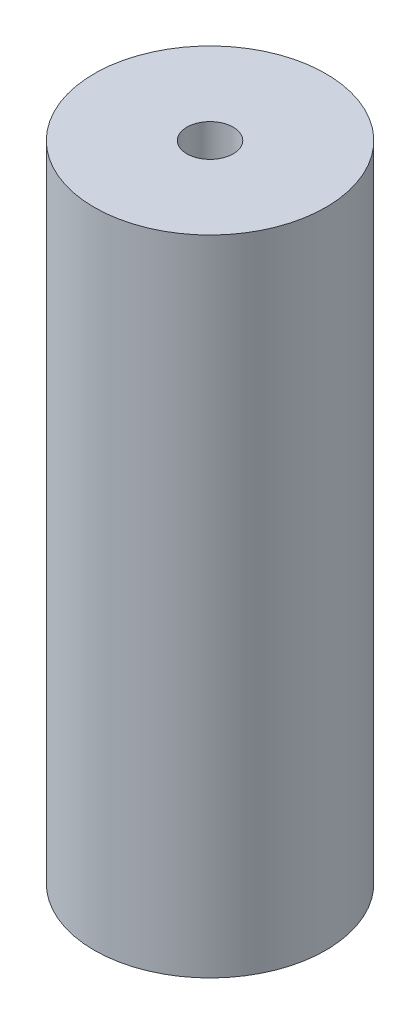
ISO-10303-21;
HEADER;
FILE_DESCRIPTION(('STEP AP214'),'2;1');
FILE_NAME('part.step','',(''),(''),'','','');
FILE_SCHEMA(('AUTOMOTIVE_DESIGN { 1 0 10303 214 1 1 1 1 }'));
ENDSEC;
DATA;
#1=APPLICATION_CONTEXT('core data for automotive mechanical design processes');
#2=APPLICATION_PROTOCOL_DEFINITION('international standard','automotive_design',2000,#1);
#3=PRODUCT_CONTEXT('',#1,'mechanical');
#4=PRODUCT('Part','Part','',(#3));
#5=PRODUCT_RELATED_PRODUCT_CATEGORY('part','',(#4));
#6=PRODUCT_DEFINITION_FORMATION('','',#4);
#7=PRODUCT_DEFINITION_CONTEXT('part definition',#1,'design');
#8=PRODUCT_DEFINITION('design','',#6,#7);
#9=PRODUCT_DEFINITION_SHAPE('','',#8);
#10=(LENGTH_UNIT() NAMED_UNIT(*) SI_UNIT(.MILLI.,.METRE.));
#11=(NAMED_UNIT(*) PLANE_ANGLE_UNIT() SI_UNIT($,.RADIAN.));
#12=(NAMED_UNIT(*) SI_UNIT($,.STERADIAN.) SOLID_ANGLE_UNIT());
#13=UNCERTAINTY_MEASURE_WITH_UNIT(LENGTH_MEASURE(1.E-05),#10,'distance_accuracy_value','');
#14=(GEOMETRIC_REPRESENTATION_CONTEXT(3) GLOBAL_UNCERTAINTY_ASSIGNED_CONTEXT((#13)) GLOBAL_UNIT_ASSIGNED_CONTEXT((#10,
#11,#12)) REPRESENTATION_CONTEXT('',''));
#15=CARTESIAN_POINT('',(0.,0.,0.));
#16=DIRECTION('',(0.,0.,1.));
#17=DIRECTION('',(1.,0.,0.));
#18=AXIS2_PLACEMENT_3D('',#15,#16,#17);
#19=CARTESIAN_POINT('',(0.,0.,0.));
#20=DIRECTION('',(0.,1.,0.));
#21=DIRECTION('',(0.,0.,1.));
#22=AXIS2_PLACEMENT_3D('',#19,#20,#21);
#23=PLANE('',#22);
#24=CARTESIAN_POINT('',(0.,0.,0.));
#25=DIRECTION('',(0.,1.,0.));
#26=DIRECTION('',(0.,0.,1.));
#27=AXIS2_PLACEMENT_3D('',#24,#25,#26);
#28=CIRCLE('',#27,4.5);
#29=CARTESIAN_POINT('',(0.,0.,4.5));
#30=VERTEX_POINT('',#29);
#31=EDGE_CURVE('E10',#30,#30,#28,.T.);
#32=ORIENTED_EDGE('',*,*,#31,.F.);
#33=EDGE_LOOP('',(#32));
#34=FACE_BOUND('',#33,.T.);
#35=CARTESIAN_POINT('',(0.,0.,0.));
#36=DIRECTION('',(0.,1.,0.));
#37=DIRECTION('',(0.,0.,1.));
#38=AXIS2_PLACEMENT_3D('',#35,#36,#37);
#39=CIRCLE('',#38,2.05);
#40=CARTESIAN_POINT('',(0.,0.,2.05));
#41=VERTEX_POINT('',#40);
#42=EDGE_CURVE('E42',#41,#41,#39,.T.);
#43=ORIENTED_EDGE('',*,*,#42,.T.);
#44=EDGE_LOOP('',(#43));
#45=FACE_BOUND('',#44,.T.);
#46=ADVANCED_FACE('F35',(#34,#45),#23,.F.);
#47=CARTESIAN_POINT('',(0.,10.,0.));
#48=DIRECTION('',(0.,-1.,0.));
#49=DIRECTION('',(0.,0.,-1.));
#50=AXIS2_PLACEMENT_3D('',#47,#48,#49);
#51=CYLINDRICAL_SURFACE('',#50,4.5);
#52=ORIENTED_EDGE('',*,*,#31,.T.);
#53=EDGE_LOOP('',(#52));
#54=FACE_BOUND('',#53,.T.);
#55=CARTESIAN_POINT('',(0.,25.,0.));
#56=DIRECTION('',(0.,1.,0.));
#57=DIRECTION('',(0.,0.,1.));
#58=AXIS2_PLACEMENT_3D('',#55,#56,#57);
#59=CIRCLE('',#58,4.5);
#60=CARTESIAN_POINT('',(0.,25.,4.5));
#61=VERTEX_POINT('',#60);
#62=EDGE_CURVE('E50',#61,#61,#59,.T.);
#63=ORIENTED_EDGE('',*,*,#62,.F.);
#64=EDGE_LOOP('',(#63));
#65=FACE_BOUND('',#64,.T.);
#66=ADVANCED_FACE('F37',(#54,#65),#51,.T.);
#67=CARTESIAN_POINT('',(0.,10.,0.));
#68=DIRECTION('',(0.,-1.,0.));
#69=DIRECTION('',(0.,0.,-1.));
#70=AXIS2_PLACEMENT_3D('',#67,#68,#69);
#71=CYLINDRICAL_SURFACE('',#70,2.05);
#72=CARTESIAN_POINT('',(0.,10.,0.));
#73=DIRECTION('',(0.,1.,0.));
#74=DIRECTION('',(0.,0.,1.));
#75=AXIS2_PLACEMENT_3D('',#72,#73,#74);
#76=CIRCLE('',#75,2.05);
#77=CARTESIAN_POINT('',(0.,10.,2.05));
#78=VERTEX_POINT('',#77);
#79=EDGE_CURVE('E46',#78,#78,#76,.T.);
#80=ORIENTED_EDGE('',*,*,#79,.T.);
#81=EDGE_LOOP('',(#80));
#82=FACE_BOUND('',#81,.T.);
#83=ORIENTED_EDGE('',*,*,#42,.F.);
#84=EDGE_LOOP('',(#83));
#85=FACE_BOUND('',#84,.T.);
#86=ADVANCED_FACE('F75',(#82,#85),#71,.F.);
#87=CARTESIAN_POINT('',(0.,10.,0.));
#88=DIRECTION('',(0.,1.,0.));
#89=DIRECTION('',(0.,0.,1.));
#90=AXIS2_PLACEMENT_3D('',#87,#88,#89);
#91=PLANE('',#90);
#92=CARTESIAN_POINT('',(0.,10.,0.));
#93=DIRECTION('',(0.,1.,0.));
#94=DIRECTION('',(0.,0.,1.));
#95=AXIS2_PLACEMENT_3D('',#92,#93,#94);
#96=CIRCLE('',#95,0.9);
#97=CARTESIAN_POINT('',(0.,10.,0.9));
#98=VERTEX_POINT('',#97);
#99=EDGE_CURVE('E56',#98,#98,#96,.T.);
#100=ORIENTED_EDGE('',*,*,#99,.T.);
#101=EDGE_LOOP('',(#100));
#102=FACE_BOUND('',#101,.T.);
#103=ORIENTED_EDGE('',*,*,#79,.F.);
#104=EDGE_LOOP('',(#103));
#105=FACE_BOUND('',#104,.T.);
#106=ADVANCED_FACE('F67',(#102,#105),#91,.F.);
#107=CARTESIAN_POINT('',(0.,25.,0.));
#108=DIRECTION('',(0.,1.,0.));
#109=DIRECTION('',(0.,0.,1.));
#110=AXIS2_PLACEMENT_3D('',#107,#108,#109);
#111=PLANE('',#110);
#112=ORIENTED_EDGE('',*,*,#62,.T.);
#113=EDGE_LOOP('',(#112));
#114=FACE_BOUND('',#113,.T.);
#115=CARTESIAN_POINT('',(0.,25.,0.));
#116=DIRECTION('',(0.,1.,0.));
#117=DIRECTION('',(0.,0.,1.));
#118=AXIS2_PLACEMENT_3D('',#115,#116,#117);
#119=CIRCLE('',#118,0.9);
#120=CARTESIAN_POINT('',(0.,25.,0.9));
#121=VERTEX_POINT('',#120);
#122=EDGE_CURVE('E55',#121,#121,#119,.T.);
#123=ORIENTED_EDGE('',*,*,#122,.F.);
#124=EDGE_LOOP('',(#123));
#125=FACE_BOUND('',#124,.T.);
#126=ADVANCED_FACE('F65',(#114,#125),#111,.T.);
#127=CARTESIAN_POINT('',(0.,25.,0.));
#128=DIRECTION('',(0.,-1.,0.));
#129=DIRECTION('',(0.,0.,-1.));
#130=AXIS2_PLACEMENT_3D('',#127,#128,#129);
#131=CYLINDRICAL_SURFACE('',#130,0.9);
#132=ORIENTED_EDGE('',*,*,#122,.T.);
#133=EDGE_LOOP('',(#132));
#134=FACE_BOUND('',#133,.T.);
#135=ORIENTED_EDGE('',*,*,#99,.F.);
#136=EDGE_LOOP('',(#135));
#137=FACE_BOUND('',#136,.T.);
#138=ADVANCED_FACE('F62',(#134,#137),#131,.F.);
#139=CLOSED_SHELL('',(#46,#66,#86,#106,#126,#138));
#140=MANIFOLD_SOLID_BREP('B2',#139);
#141=ADVANCED_BREP_SHAPE_REPRESENTATION('',(#18,#140),#14);
#142=SHAPE_DEFINITION_REPRESENTATION(#9,#141);
ENDSEC;
END-ISO-10303-21;
